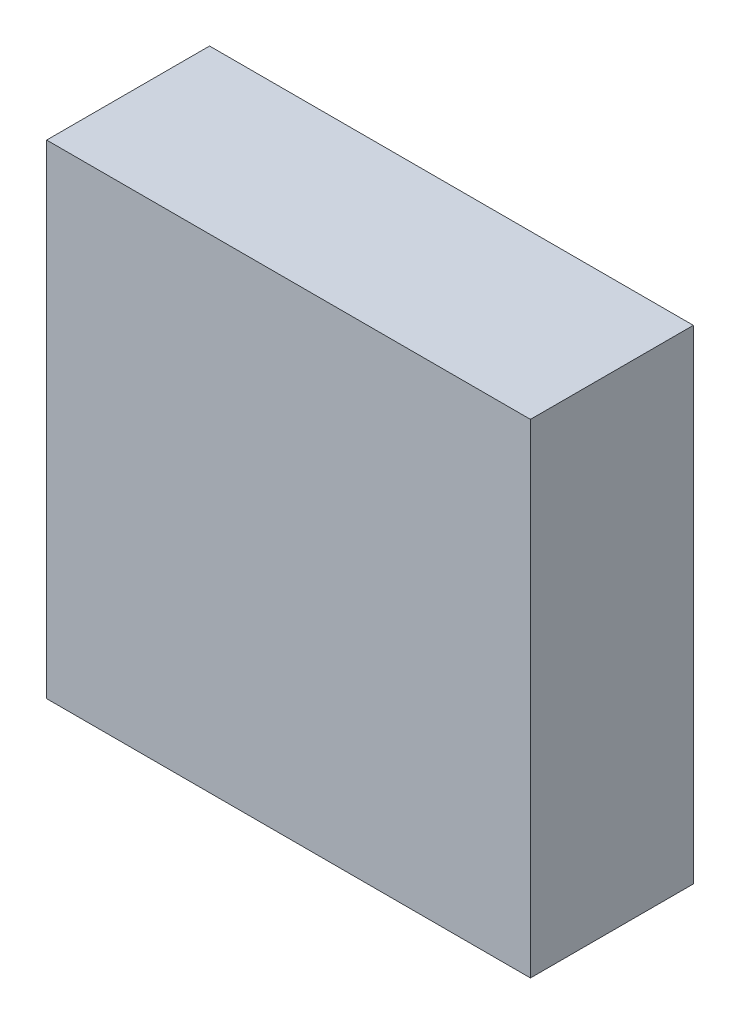
ISO-10303-21;
HEADER;
FILE_DESCRIPTION(('STEP AP214'),'2;1');
FILE_NAME('part.step','',(''),(''),'','','');
FILE_SCHEMA(('AUTOMOTIVE_DESIGN { 1 0 10303 214 1 1 1 1 }'));
ENDSEC;
DATA;
#1=APPLICATION_CONTEXT('core data for automotive mechanical design processes');
#2=APPLICATION_PROTOCOL_DEFINITION('international standard','automotive_design',2000,#1);
#3=PRODUCT_CONTEXT('',#1,'mechanical');
#4=PRODUCT('Part','Part','',(#3));
#5=PRODUCT_RELATED_PRODUCT_CATEGORY('part','',(#4));
#6=PRODUCT_DEFINITION_FORMATION('','',#4);
#7=PRODUCT_DEFINITION_CONTEXT('part definition',#1,'design');
#8=PRODUCT_DEFINITION('design','',#6,#7);
#9=PRODUCT_DEFINITION_SHAPE('','',#8);
#10=(LENGTH_UNIT() NAMED_UNIT(*) SI_UNIT(.MILLI.,.METRE.));
#11=(NAMED_UNIT(*) PLANE_ANGLE_UNIT() SI_UNIT($,.RADIAN.));
#12=(NAMED_UNIT(*) SI_UNIT($,.STERADIAN.) SOLID_ANGLE_UNIT());
#13=UNCERTAINTY_MEASURE_WITH_UNIT(LENGTH_MEASURE(1.E-05),#10,'distance_accuracy_value','');
#14=(GEOMETRIC_REPRESENTATION_CONTEXT(3) GLOBAL_UNCERTAINTY_ASSIGNED_CONTEXT((#13)) GLOBAL_UNIT_ASSIGNED_CONTEXT((#10,
#11,#12)) REPRESENTATION_CONTEXT('',''));
#15=CARTESIAN_POINT('',(0.,0.,0.));
#16=DIRECTION('',(0.,0.,1.));
#17=DIRECTION('',(1.,0.,0.));
#18=AXIS2_PLACEMENT_3D('',#15,#16,#17);
#19=CARTESIAN_POINT('',(0.,0.,100.));
#20=DIRECTION('',(1.,0.,0.));
#21=DIRECTION('',(0.,1.,0.));
#22=AXIS2_PLACEMENT_3D('',#19,#20,#21);
#23=PLANE('',#22);
#24=DIRECTION('',(0.,-1.,0.));
#25=VECTOR('',#24,1.);
#26=CARTESIAN_POINT('',(0.,0.,0.));
#27=LINE('',#26,#25);
#28=CARTESIAN_POINT('',(0.,0.,0.));
#29=VERTEX_POINT('',#28);
#30=CARTESIAN_POINT('',(0.,-297.,0.));
#31=VERTEX_POINT('',#30);
#32=EDGE_CURVE('E96',#29,#31,#27,.T.);
#33=ORIENTED_EDGE('',*,*,#32,.T.);
#34=DIRECTION('',(0.,0.,-1.));
#35=VECTOR('',#34,1.);
#36=CARTESIAN_POINT('',(0.,-297.,100.));
#37=LINE('',#36,#35);
#38=CARTESIAN_POINT('',(0.,-297.,100.));
#39=VERTEX_POINT('',#38);
#40=EDGE_CURVE('E11',#39,#31,#37,.T.);
#41=ORIENTED_EDGE('',*,*,#40,.F.);
#42=DIRECTION('',(0.,-1.,0.));
#43=VECTOR('',#42,1.);
#44=CARTESIAN_POINT('',(0.,0.,100.));
#45=LINE('',#44,#43);
#46=CARTESIAN_POINT('',(0.,0.,100.));
#47=VERTEX_POINT('',#46);
#48=EDGE_CURVE('E84',#47,#39,#45,.T.);
#49=ORIENTED_EDGE('',*,*,#48,.F.);
#50=DIRECTION('',(0.,0.,-1.));
#51=VECTOR('',#50,1.);
#52=CARTESIAN_POINT('',(0.,0.,100.));
#53=LINE('',#52,#51);
#54=EDGE_CURVE('E92',#47,#29,#53,.T.);
#55=ORIENTED_EDGE('',*,*,#54,.T.);
#56=EDGE_LOOP('',(#33,#41,#49,#55));
#57=FACE_BOUND('',#56,.T.);
#58=ADVANCED_FACE('F33',(#57),#23,.F.);
#59=CARTESIAN_POINT('',(0.,-297.,100.));
#60=DIRECTION('',(0.,1.,0.));
#61=DIRECTION('',(0.,0.,1.));
#62=AXIS2_PLACEMENT_3D('',#59,#60,#61);
#63=PLANE('',#62);
#64=DIRECTION('',(1.,0.,0.));
#65=VECTOR('',#64,1.);
#66=CARTESIAN_POINT('',(0.,-297.,0.));
#67=LINE('',#66,#65);
#68=CARTESIAN_POINT('',(297.,-297.,0.));
#69=VERTEX_POINT('',#68);
#70=EDGE_CURVE('E88',#31,#69,#67,.T.);
#71=ORIENTED_EDGE('',*,*,#70,.T.);
#72=DIRECTION('',(0.,0.,-1.));
#73=VECTOR('',#72,1.);
#74=CARTESIAN_POINT('',(297.,-297.,100.));
#75=LINE('',#74,#73);
#76=CARTESIAN_POINT('',(297.,-297.,100.));
#77=VERTEX_POINT('',#76);
#78=EDGE_CURVE('E41',#77,#69,#75,.T.);
#79=ORIENTED_EDGE('',*,*,#78,.F.);
#80=DIRECTION('',(1.,0.,0.));
#81=VECTOR('',#80,1.);
#82=CARTESIAN_POINT('',(0.,-297.,100.));
#83=LINE('',#82,#81);
#84=EDGE_CURVE('E79',#39,#77,#83,.T.);
#85=ORIENTED_EDGE('',*,*,#84,.F.);
#86=ORIENTED_EDGE('',*,*,#40,.T.);
#87=EDGE_LOOP('',(#71,#79,#85,#86));
#88=FACE_BOUND('',#87,.T.);
#89=ADVANCED_FACE('F87',(#88),#63,.F.);
#90=CARTESIAN_POINT('',(297.,0.,100.));
#91=DIRECTION('',(-1.,0.,0.));
#92=DIRECTION('',(0.,-1.,0.));
#93=AXIS2_PLACEMENT_3D('',#90,#91,#92);
#94=PLANE('',#93);
#95=DIRECTION('',(0.,1.,0.));
#96=VECTOR('',#95,1.);
#97=CARTESIAN_POINT('',(297.,0.,0.));
#98=LINE('',#97,#96);
#99=CARTESIAN_POINT('',(297.,0.,0.));
#100=VERTEX_POINT('',#99);
#101=EDGE_CURVE('E66',#69,#100,#98,.T.);
#102=ORIENTED_EDGE('',*,*,#101,.T.);
#103=DIRECTION('',(0.,0.,-1.));
#104=VECTOR('',#103,1.);
#105=CARTESIAN_POINT('',(297.,0.,100.));
#106=LINE('',#105,#104);
#107=CARTESIAN_POINT('',(297.,0.,100.));
#108=VERTEX_POINT('',#107);
#109=EDGE_CURVE('E89',#108,#100,#106,.T.);
#110=ORIENTED_EDGE('',*,*,#109,.F.);
#111=DIRECTION('',(0.,1.,0.));
#112=VECTOR('',#111,1.);
#113=CARTESIAN_POINT('',(297.,0.,100.));
#114=LINE('',#113,#112);
#115=EDGE_CURVE('E82',#77,#108,#114,.T.);
#116=ORIENTED_EDGE('',*,*,#115,.F.);
#117=ORIENTED_EDGE('',*,*,#78,.T.);
#118=EDGE_LOOP('',(#102,#110,#116,#117));
#119=FACE_BOUND('',#118,.T.);
#120=ADVANCED_FACE('F90',(#119),#94,.F.);
#121=CARTESIAN_POINT('',(0.,0.,100.));
#122=DIRECTION('',(0.,-1.,0.));
#123=DIRECTION('',(0.,0.,-1.));
#124=AXIS2_PLACEMENT_3D('',#121,#122,#123);
#125=PLANE('',#124);
#126=DIRECTION('',(-1.,0.,0.));
#127=VECTOR('',#126,1.);
#128=CARTESIAN_POINT('',(0.,0.,0.));
#129=LINE('',#128,#127);
#130=EDGE_CURVE('E72',#100,#29,#129,.T.);
#131=ORIENTED_EDGE('',*,*,#130,.T.);
#132=ORIENTED_EDGE('',*,*,#54,.F.);
#133=DIRECTION('',(-1.,0.,0.));
#134=VECTOR('',#133,1.);
#135=CARTESIAN_POINT('',(0.,0.,100.));
#136=LINE('',#135,#134);
#137=EDGE_CURVE('E49',#108,#47,#136,.T.);
#138=ORIENTED_EDGE('',*,*,#137,.F.);
#139=ORIENTED_EDGE('',*,*,#109,.T.);
#140=EDGE_LOOP('',(#131,#132,#138,#139));
#141=FACE_BOUND('',#140,.T.);
#142=ADVANCED_FACE('F103',(#141),#125,.F.);
#143=CARTESIAN_POINT('',(0.,0.,100.));
#144=DIRECTION('',(0.,0.,1.));
#145=DIRECTION('',(1.,0.,0.));
#146=AXIS2_PLACEMENT_3D('',#143,#144,#145);
#147=PLANE('',#146);
#148=ORIENTED_EDGE('',*,*,#48,.T.);
#149=ORIENTED_EDGE('',*,*,#84,.T.);
#150=ORIENTED_EDGE('',*,*,#115,.T.);
#151=ORIENTED_EDGE('',*,*,#137,.T.);
#152=EDGE_LOOP('',(#148,#149,#150,#151));
#153=FACE_BOUND('',#152,.T.);
#154=ADVANCED_FACE('F80',(#153),#147,.T.);
#155=CARTESIAN_POINT('',(0.,0.,0.));
#156=DIRECTION('',(0.,0.,1.));
#157=DIRECTION('',(1.,0.,0.));
#158=AXIS2_PLACEMENT_3D('',#155,#156,#157);
#159=PLANE('',#158);
#160=ORIENTED_EDGE('',*,*,#32,.F.);
#161=ORIENTED_EDGE('',*,*,#130,.F.);
#162=ORIENTED_EDGE('',*,*,#101,.F.);
#163=ORIENTED_EDGE('',*,*,#70,.F.);
#164=EDGE_LOOP('',(#160,#161,#162,#163));
#165=FACE_BOUND('',#164,.T.);
#166=ADVANCED_FACE('F106',(#165),#159,.F.);
#167=CLOSED_SHELL('',(#58,#89,#120,#142,#154,#166));
#168=MANIFOLD_SOLID_BREP('B2',#167);
#169=ADVANCED_BREP_SHAPE_REPRESENTATION('',(#18,#168),#14);
#170=SHAPE_DEFINITION_REPRESENTATION(#9,#169);
ENDSEC;
END-ISO-10303-21;
